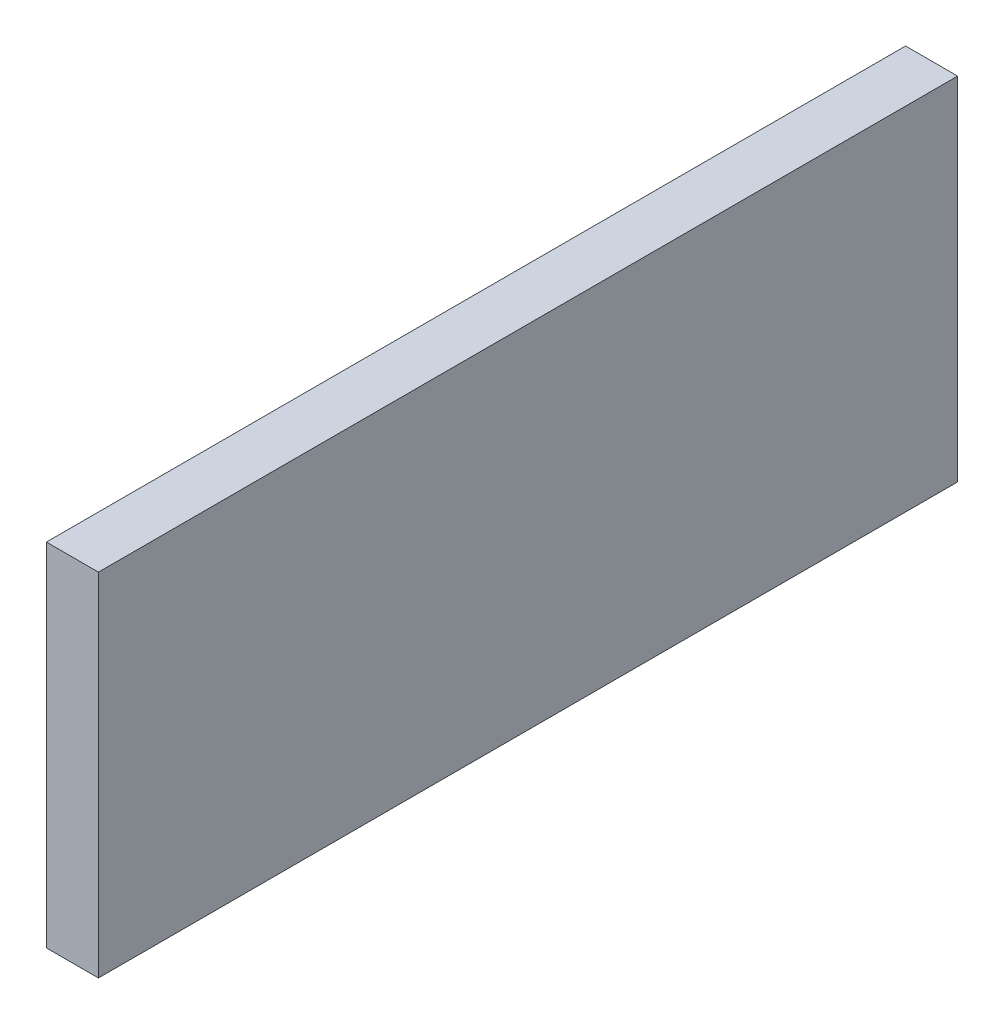
ISO-10303-21;
HEADER;
FILE_DESCRIPTION(('STEP AP214'),'2;1');
FILE_NAME('part.step','',(''),(''),'','','');
FILE_SCHEMA(('AUTOMOTIVE_DESIGN { 1 0 10303 214 1 1 1 1 }'));
ENDSEC;
DATA;
#1=APPLICATION_CONTEXT('core data for automotive mechanical design processes');
#2=APPLICATION_PROTOCOL_DEFINITION('international standard','automotive_design',2000,#1);
#3=PRODUCT_CONTEXT('',#1,'mechanical');
#4=PRODUCT('Part','Part','',(#3));
#5=PRODUCT_RELATED_PRODUCT_CATEGORY('part','',(#4));
#6=PRODUCT_DEFINITION_FORMATION('','',#4);
#7=PRODUCT_DEFINITION_CONTEXT('part definition',#1,'design');
#8=PRODUCT_DEFINITION('design','',#6,#7);
#9=PRODUCT_DEFINITION_SHAPE('','',#8);
#10=(LENGTH_UNIT() NAMED_UNIT(*) SI_UNIT(.MILLI.,.METRE.));
#11=(NAMED_UNIT(*) PLANE_ANGLE_UNIT() SI_UNIT($,.RADIAN.));
#12=(NAMED_UNIT(*) SI_UNIT($,.STERADIAN.) SOLID_ANGLE_UNIT());
#13=UNCERTAINTY_MEASURE_WITH_UNIT(LENGTH_MEASURE(1.E-05),#10,'distance_accuracy_value','');
#14=(GEOMETRIC_REPRESENTATION_CONTEXT(3) GLOBAL_UNCERTAINTY_ASSIGNED_CONTEXT((#13)) GLOBAL_UNIT_ASSIGNED_CONTEXT((#10,
#11,#12)) REPRESENTATION_CONTEXT('',''));
#15=CARTESIAN_POINT('',(0.,0.,0.));
#16=DIRECTION('',(0.,0.,1.));
#17=DIRECTION('',(1.,0.,0.));
#18=AXIS2_PLACEMENT_3D('',#15,#16,#17);
#19=CARTESIAN_POINT('',(399.999999999999,5540.,3731.78752511649));
#20=DIRECTION('',(1.,0.,0.));
#21=DIRECTION('',(0.,1.,0.));
#22=AXIS2_PLACEMENT_3D('',#19,#20,#21);
#23=PLANE('',#22);
#24=DIRECTION('',(0.,-1.,0.));
#25=VECTOR('',#24,1.);
#26=CARTESIAN_POINT('',(399.999999999999,5540.,2640.));
#27=LINE('',#26,#25);
#28=CARTESIAN_POINT('',(399.999999999999,6620.,2640.));
#29=VERTEX_POINT('',#28);
#30=CARTESIAN_POINT('',(399.999999999999,5540.,2640.));
#31=VERTEX_POINT('',#30);
#32=EDGE_CURVE('E83',#29,#31,#27,.T.);
#33=ORIENTED_EDGE('',*,*,#32,.F.);
#34=DIRECTION('',(0.,0.,-1.));
#35=VECTOR('',#34,1.);
#36=CARTESIAN_POINT('',(399.999999999999,6620.,3731.78752511649));
#37=LINE('',#36,#35);
#38=CARTESIAN_POINT('',(399.999999999999,6620.,0.));
#39=VERTEX_POINT('',#38);
#40=EDGE_CURVE('E37',#29,#39,#37,.T.);
#41=ORIENTED_EDGE('',*,*,#40,.T.);
#42=DIRECTION('',(0.,-1.,0.));
#43=VECTOR('',#42,1.);
#44=CARTESIAN_POINT('',(399.999999999999,5540.,0.));
#45=LINE('',#44,#43);
#46=CARTESIAN_POINT('',(399.999999999999,5540.,0.));
#47=VERTEX_POINT('',#46);
#48=EDGE_CURVE('E81',#39,#47,#45,.T.);
#49=ORIENTED_EDGE('',*,*,#48,.T.);
#50=DIRECTION('',(0.,0.,-1.));
#51=VECTOR('',#50,1.);
#52=CARTESIAN_POINT('',(399.999999999999,5540.,3731.78752511649));
#53=LINE('',#52,#51);
#54=EDGE_CURVE('E72',#31,#47,#53,.T.);
#55=ORIENTED_EDGE('',*,*,#54,.F.);
#56=EDGE_LOOP('',(#33,#41,#49,#55));
#57=FACE_BOUND('',#56,.T.);
#58=ADVANCED_FACE('F33',(#57),#23,.F.);
#59=CARTESIAN_POINT('',(399.999999999999,5540.,3731.78752511649));
#60=DIRECTION('',(0.,1.,0.));
#61=DIRECTION('',(0.,0.,1.));
#62=AXIS2_PLACEMENT_3D('',#59,#60,#61);
#63=PLANE('',#62);
#64=DIRECTION('',(1.,0.,0.));
#65=VECTOR('',#64,1.);
#66=CARTESIAN_POINT('',(399.999999999999,5540.,2640.));
#67=LINE('',#66,#65);
#68=CARTESIAN_POINT('',(560.,5540.,2640.));
#69=VERTEX_POINT('',#68);
#70=EDGE_CURVE('E42',#31,#69,#67,.T.);
#71=ORIENTED_EDGE('',*,*,#70,.F.);
#72=ORIENTED_EDGE('',*,*,#54,.T.);
#73=DIRECTION('',(1.,0.,0.));
#74=VECTOR('',#73,1.);
#75=CARTESIAN_POINT('',(399.999999999999,5540.,0.));
#76=LINE('',#75,#74);
#77=CARTESIAN_POINT('',(560.,5540.,0.));
#78=VERTEX_POINT('',#77);
#79=EDGE_CURVE('E93',#47,#78,#76,.T.);
#80=ORIENTED_EDGE('',*,*,#79,.T.);
#81=DIRECTION('',(0.,0.,-1.));
#82=VECTOR('',#81,1.);
#83=CARTESIAN_POINT('',(560.,5540.,3731.78752511649));
#84=LINE('',#83,#82);
#85=EDGE_CURVE('E102',#69,#78,#84,.T.);
#86=ORIENTED_EDGE('',*,*,#85,.F.);
#87=EDGE_LOOP('',(#71,#72,#80,#86));
#88=FACE_BOUND('',#87,.T.);
#89=ADVANCED_FACE('F106',(#88),#63,.F.);
#90=CARTESIAN_POINT('',(560.,5540.,3731.78752511649));
#91=DIRECTION('',(-1.,0.,0.));
#92=DIRECTION('',(0.,0.,1.));
#93=AXIS2_PLACEMENT_3D('',#90,#91,#92);
#94=PLANE('',#93);
#95=DIRECTION('',(0.,1.,0.));
#96=VECTOR('',#95,1.);
#97=CARTESIAN_POINT('',(560.,5540.,2640.));
#98=LINE('',#97,#96);
#99=CARTESIAN_POINT('',(560.,6620.,2640.));
#100=VERTEX_POINT('',#99);
#101=EDGE_CURVE('E11',#69,#100,#98,.T.);
#102=ORIENTED_EDGE('',*,*,#101,.F.);
#103=ORIENTED_EDGE('',*,*,#85,.T.);
#104=DIRECTION('',(0.,1.,0.));
#105=VECTOR('',#104,1.);
#106=CARTESIAN_POINT('',(560.,5540.,0.));
#107=LINE('',#106,#105);
#108=CARTESIAN_POINT('',(560.,6620.,0.));
#109=VERTEX_POINT('',#108);
#110=EDGE_CURVE('E103',#78,#109,#107,.T.);
#111=ORIENTED_EDGE('',*,*,#110,.T.);
#112=DIRECTION('',(0.,0.,-1.));
#113=VECTOR('',#112,1.);
#114=CARTESIAN_POINT('',(560.,6620.,3731.78752511649));
#115=LINE('',#114,#113);
#116=EDGE_CURVE('E55',#100,#109,#115,.T.);
#117=ORIENTED_EDGE('',*,*,#116,.F.);
#118=EDGE_LOOP('',(#102,#103,#111,#117));
#119=FACE_BOUND('',#118,.T.);
#120=ADVANCED_FACE('F105',(#119),#94,.F.);
#121=CARTESIAN_POINT('',(399.999999999999,6620.,3731.78752511649));
#122=DIRECTION('',(0.,-1.,0.));
#123=DIRECTION('',(0.,0.,-1.));
#124=AXIS2_PLACEMENT_3D('',#121,#122,#123);
#125=PLANE('',#124);
#126=DIRECTION('',(-1.,0.,0.));
#127=VECTOR('',#126,1.);
#128=CARTESIAN_POINT('',(399.999999999999,6620.,2640.));
#129=LINE('',#128,#127);
#130=EDGE_CURVE('E90',#100,#29,#129,.T.);
#131=ORIENTED_EDGE('',*,*,#130,.F.);
#132=ORIENTED_EDGE('',*,*,#116,.T.);
#133=DIRECTION('',(-1.,0.,0.));
#134=VECTOR('',#133,1.);
#135=CARTESIAN_POINT('',(399.999999999999,6620.,0.));
#136=LINE('',#135,#134);
#137=EDGE_CURVE('E86',#109,#39,#136,.T.);
#138=ORIENTED_EDGE('',*,*,#137,.T.);
#139=ORIENTED_EDGE('',*,*,#40,.F.);
#140=EDGE_LOOP('',(#131,#132,#138,#139));
#141=FACE_BOUND('',#140,.T.);
#142=ADVANCED_FACE('F87',(#141),#125,.F.);
#143=CARTESIAN_POINT('',(0.,0.,0.));
#144=DIRECTION('',(0.,0.,-1.));
#145=DIRECTION('',(-1.,0.,0.));
#146=AXIS2_PLACEMENT_3D('',#143,#144,#145);
#147=PLANE('',#146);
#148=ORIENTED_EDGE('',*,*,#48,.F.);
#149=ORIENTED_EDGE('',*,*,#137,.F.);
#150=ORIENTED_EDGE('',*,*,#110,.F.);
#151=ORIENTED_EDGE('',*,*,#79,.F.);
#152=EDGE_LOOP('',(#148,#149,#150,#151));
#153=FACE_BOUND('',#152,.T.);
#154=ADVANCED_FACE('F92',(#153),#147,.T.);
#155=CARTESIAN_POINT('',(0.,0.,2640.));
#156=DIRECTION('',(0.,0.,1.));
#157=DIRECTION('',(0.,-1.,0.));
#158=AXIS2_PLACEMENT_3D('',#155,#156,#157);
#159=PLANE('',#158);
#160=ORIENTED_EDGE('',*,*,#130,.T.);
#161=ORIENTED_EDGE('',*,*,#32,.T.);
#162=ORIENTED_EDGE('',*,*,#70,.T.);
#163=ORIENTED_EDGE('',*,*,#101,.T.);
#164=EDGE_LOOP('',(#160,#161,#162,#163));
#165=FACE_BOUND('',#164,.T.);
#166=ADVANCED_FACE('F35',(#165),#159,.T.);
#167=CLOSED_SHELL('',(#58,#89,#120,#142,#154,#166));
#168=MANIFOLD_SOLID_BREP('B2',#167);
#169=ADVANCED_BREP_SHAPE_REPRESENTATION('',(#18,#168),#14);
#170=SHAPE_DEFINITION_REPRESENTATION(#9,#169);
ENDSEC;
END-ISO-10303-21;
